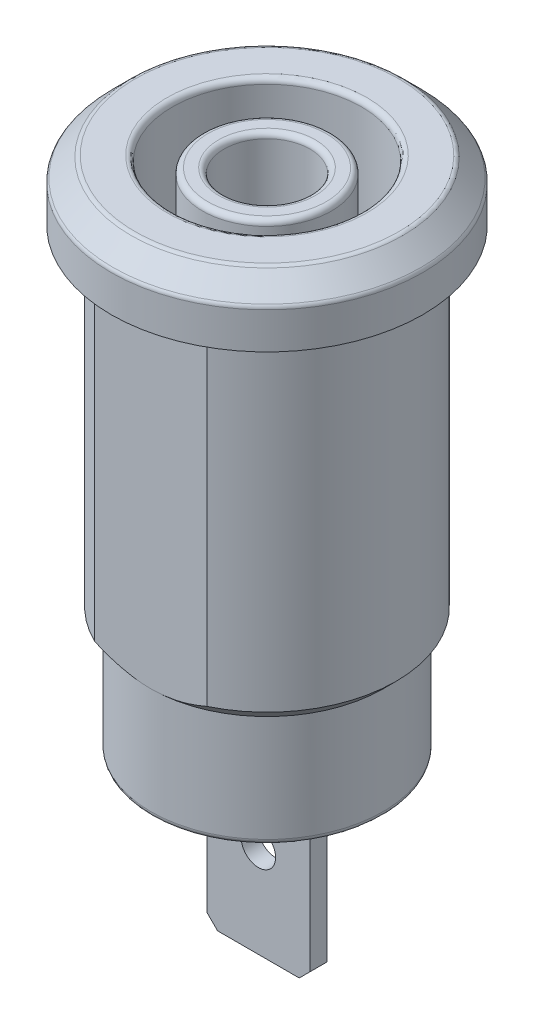
ISO-10303-21;
HEADER;
FILE_DESCRIPTION(('STEP AP214'),'2;1');
FILE_NAME('part.step','',(''),(''),'','','');
FILE_SCHEMA(('AUTOMOTIVE_DESIGN { 1 0 10303 214 1 1 1 1 }'));
ENDSEC;
DATA;
#1=APPLICATION_CONTEXT('core data for automotive mechanical design processes');
#2=APPLICATION_PROTOCOL_DEFINITION('international standard','automotive_design',2000,#1);
#3=PRODUCT_CONTEXT('',#1,'mechanical');
#4=PRODUCT('Part','Part','',(#3));
#5=PRODUCT_RELATED_PRODUCT_CATEGORY('part','',(#4));
#6=PRODUCT_DEFINITION_FORMATION('','',#4);
#7=PRODUCT_DEFINITION_CONTEXT('part definition',#1,'design');
#8=PRODUCT_DEFINITION('design','',#6,#7);
#9=PRODUCT_DEFINITION_SHAPE('','',#8);
#10=(LENGTH_UNIT() NAMED_UNIT(*) SI_UNIT(.MILLI.,.METRE.));
#11=(NAMED_UNIT(*) PLANE_ANGLE_UNIT() SI_UNIT($,.RADIAN.));
#12=(NAMED_UNIT(*) SI_UNIT($,.STERADIAN.) SOLID_ANGLE_UNIT());
#13=UNCERTAINTY_MEASURE_WITH_UNIT(LENGTH_MEASURE(1.E-05),#10,'distance_accuracy_value','');
#14=(GEOMETRIC_REPRESENTATION_CONTEXT(3) GLOBAL_UNCERTAINTY_ASSIGNED_CONTEXT((#13)) GLOBAL_UNIT_ASSIGNED_CONTEXT((#10,
#11,#12)) REPRESENTATION_CONTEXT('',''));
#15=CARTESIAN_POINT('',(0.,0.,0.));
#16=DIRECTION('',(0.,0.,1.));
#17=DIRECTION('',(1.,0.,0.));
#18=AXIS2_PLACEMENT_3D('',#15,#16,#17);
#19=CARTESIAN_POINT('',(0.,-24.,0.));
#20=DIRECTION('',(0.,-1.,0.));
#21=DIRECTION('',(0.,0.,-1.));
#22=AXIS2_PLACEMENT_3D('',#19,#20,#21);
#23=CYLINDRICAL_SURFACE('',#22,6.);
#24=DIRECTION('',(0.,-1.,0.));
#25=VECTOR('',#24,1.);
#26=CARTESIAN_POINT('',(2.6153393661244,17.911157620954,-5.4));
#27=LINE('',#26,#25);
#28=CARTESIAN_POINT('',(2.6153393661244,-2.8,-5.4));
#29=VERTEX_POINT('',#28);
#30=CARTESIAN_POINT('',(2.6153393661244,-18.2,-5.4));
#31=VERTEX_POINT('',#30);
#32=EDGE_CURVE('E153',#29,#31,#27,.T.);
#33=ORIENTED_EDGE('',*,*,#32,.F.);
#34=CARTESIAN_POINT('',(0.,-2.8,0.));
#35=DIRECTION('',(0.,-1.,0.));
#36=DIRECTION('',(0.,0.,-1.));
#37=AXIS2_PLACEMENT_3D('',#34,#35,#36);
#38=CIRCLE('',#37,6.);
#39=CARTESIAN_POINT('',(2.6153393661244,-2.8,5.4));
#40=VERTEX_POINT('',#39);
#41=EDGE_CURVE('E148',#29,#40,#38,.T.);
#42=ORIENTED_EDGE('',*,*,#41,.T.);
#43=DIRECTION('',(0.,-1.,0.));
#44=VECTOR('',#43,1.);
#45=CARTESIAN_POINT('',(2.6153393661244,17.911157620954,5.4));
#46=LINE('',#45,#44);
#47=CARTESIAN_POINT('',(2.6153393661244,-18.2,5.4));
#48=VERTEX_POINT('',#47);
#49=EDGE_CURVE('E130',#40,#48,#46,.T.);
#50=ORIENTED_EDGE('',*,*,#49,.T.);
#51=CARTESIAN_POINT('',(0.,-18.2,0.));
#52=DIRECTION('',(0.,-1.,0.));
#53=DIRECTION('',(0.,0.,-1.));
#54=AXIS2_PLACEMENT_3D('',#51,#52,#53);
#55=CIRCLE('',#54,6.);
#56=EDGE_CURVE('E159',#31,#48,#55,.T.);
#57=ORIENTED_EDGE('',*,*,#56,.F.);
#58=EDGE_LOOP('',(#33,#42,#50,#57));
#59=FACE_BOUND('',#58,.T.);
#60=ADVANCED_FACE('F46',(#59),#23,.T.);
#61=DIRECTION('',(0.,-1.,0.));
#62=VECTOR('',#61,1.);
#63=CARTESIAN_POINT('',(-2.6153393661244,17.911157620954,-5.4));
#64=LINE('',#63,#62);
#65=CARTESIAN_POINT('',(-2.6153393661244,-2.8,-5.4));
#66=VERTEX_POINT('',#65);
#67=CARTESIAN_POINT('',(-2.6153393661244,-18.2,-5.4));
#68=VERTEX_POINT('',#67);
#69=EDGE_CURVE('E681',#66,#68,#64,.T.);
#70=ORIENTED_EDGE('',*,*,#69,.T.);
#71=CARTESIAN_POINT('',(-2.6153393661244,-18.2,5.4));
#72=VERTEX_POINT('',#71);
#73=EDGE_CURVE('E290',#72,#68,#55,.T.);
#74=ORIENTED_EDGE('',*,*,#73,.F.);
#75=DIRECTION('',(0.,-1.,0.));
#76=VECTOR('',#75,1.);
#77=CARTESIAN_POINT('',(-2.6153393661244,17.911157620954,5.4));
#78=LINE('',#77,#76);
#79=CARTESIAN_POINT('',(-2.6153393661244,-2.8,5.4));
#80=VERTEX_POINT('',#79);
#81=EDGE_CURVE('E141',#80,#72,#78,.T.);
#82=ORIENTED_EDGE('',*,*,#81,.F.);
#83=EDGE_CURVE('E150',#80,#66,#38,.T.);
#84=ORIENTED_EDGE('',*,*,#83,.T.);
#85=EDGE_LOOP('',(#70,#74,#82,#84));
#86=FACE_BOUND('',#85,.T.);
#87=ADVANCED_FACE('F382',(#86),#23,.T.);
#88=CARTESIAN_POINT('',(0.,-18.2,0.));
#89=DIRECTION('',(0.,1.,0.));
#90=DIRECTION('',(0.,0.,1.));
#91=AXIS2_PLACEMENT_3D('',#88,#89,#90);
#92=CONICAL_SURFACE('',#91,6.,0.785398163397453);
#93=CARTESIAN_POINT('',(7.88051799855966,-14.6468558094404,-5.4));
#94=CARTESIAN_POINT('',(7.74017221020052,-14.7626199716313,-5.4));
#95=CARTESIAN_POINT('',(7.59934854294888,-14.8778077851178,-5.4));
#96=CARTESIAN_POINT('',(7.31659914119185,-15.1068319058643,-5.4));
#97=CARTESIAN_POINT('',(7.17467336980966,-15.2206681675757,-5.4));
#98=CARTESIAN_POINT('',(6.88940206289736,-15.446925967279,-5.4));
#99=CARTESIAN_POINT('',(6.74605495489742,-15.5593455277286,-5.4));
#100=CARTESIAN_POINT('',(6.45794610624799,-15.7823531493775,-5.4));
#101=CARTESIAN_POINT('',(6.31318435892511,-15.8929412019301,-5.4));
#102=CARTESIAN_POINT('',(5.86985497728603,-16.2265139061073,-5.4));
#103=CARTESIAN_POINT('',(5.56871545140075,-16.4461307639529,-5.4));
#104=CARTESIAN_POINT('',(5.11042409538005,-16.7659850586157,-5.4));
#105=CARTESIAN_POINT('',(4.95659525168662,-16.8709876096033,-5.4));
#106=CARTESIAN_POINT('',(4.64637357979973,-17.0771263411528,-5.4));
#107=CARTESIAN_POINT('',(4.48998089378888,-17.1782627350901,-5.4));
#108=CARTESIAN_POINT('',(4.13062218153672,-17.4031402386419,-5.4));
#109=CARTESIAN_POINT('',(3.9267261894353,-17.5254069715341,-5.4));
#110=CARTESIAN_POINT('',(3.51329540566441,-17.759947729394,-5.4));
#111=CARTESIAN_POINT('',(3.30376234083575,-17.8722247701783,-5.4));
#112=CARTESIAN_POINT('',(2.87913300479671,-18.0831702072468,-5.4));
#113=CARTESIAN_POINT('',(2.66406812203023,-18.1819011021161,-5.4));
#114=CARTESIAN_POINT('',(2.22685748405029,-18.3622499956522,-5.4));
#115=CARTESIAN_POINT('',(2.0047156813708,-18.4438773602718,-5.4));
#116=CARTESIAN_POINT('',(1.62249657198403,-18.5634776025891,-5.4));
#117=CARTESIAN_POINT('',(1.46421343755746,-18.6071667328493,-5.4));
#118=CARTESIAN_POINT('',(1.14472131497074,-18.6821833970467,-5.4));
#119=CARTESIAN_POINT('',(0.983512735568519,-18.7135126442687,-5.4));
#120=CARTESIAN_POINT('',(0.659439725938091,-18.7622348650963,-5.4));
#121=CARTESIAN_POINT('',(0.496581268896233,-18.7796670061468,-5.4));
#122=CARTESIAN_POINT('',(0.169946440350035,-18.7997849861937,-5.4));
#123=CARTESIAN_POINT('',(0.00617010289977787,-18.802471368691,-5.4));
#124=CARTESIAN_POINT('',(-0.321096828992566,-18.7929379954228,-5.4));
#125=CARTESIAN_POINT('',(-0.484587003353726,-18.7807040560021,-5.4));
#126=CARTESIAN_POINT('',(-0.809860093596026,-18.7419987942841,-5.4));
#127=CARTESIAN_POINT('',(-0.971642859631856,-18.7155262328008,-5.4));
#128=CARTESIAN_POINT('',(-1.29306988062594,-18.6495780552557,-5.4));
#129=CARTESIAN_POINT('',(-1.45270504228862,-18.6100587244377,-5.4));
#130=CARTESIAN_POINT('',(-1.76870930749127,-18.5197367339798,-5.4));
#131=CARTESIAN_POINT('',(-1.92507838643421,-18.4689339893975,-5.4));
#132=CARTESIAN_POINT('',(-2.26242054167032,-18.3476962147427,-5.4));
#133=CARTESIAN_POINT('',(-2.44270982974381,-18.2753715460032,-5.4));
#134=CARTESIAN_POINT('',(-2.79863515154502,-18.1199753063737,-5.4));
#135=CARTESIAN_POINT('',(-2.97426897972715,-18.0368987476117,-5.4));
#136=CARTESIAN_POINT('',(-3.32150616692736,-17.8620299132164,-5.4));
#137=CARTESIAN_POINT('',(-3.49310169661547,-17.7702222086563,-5.4));
#138=CARTESIAN_POINT('',(-3.83239379345227,-17.5797630721267,-5.4));
#139=CARTESIAN_POINT('',(-4.00009091979759,-17.4811126298852,-5.4));
#140=CARTESIAN_POINT('',(-4.33318972627573,-17.2776423519917,-5.4));
#141=CARTESIAN_POINT('',(-4.49856925673257,-17.1727864262386,-5.4));
#142=CARTESIAN_POINT('',(-4.82637211814564,-16.958558008334,-5.4));
#143=CARTESIAN_POINT('',(-4.9887953626857,-16.849185384458,-5.4));
#144=CARTESIAN_POINT('',(-5.3109328562108,-16.6268606702301,-5.4));
#145=CARTESIAN_POINT('',(-5.47064958346763,-16.5139121602079,-5.4));
#146=CARTESIAN_POINT('',(-5.7878903728073,-16.2849749965794,-5.4));
#147=CARTESIAN_POINT('',(-5.94541437741838,-16.168986263517,-5.4));
#148=CARTESIAN_POINT('',(-6.25403088070918,-15.9378723762329,-5.4));
#149=CARTESIAN_POINT('',(-6.40517755457747,-15.8228194223752,-5.4));
#150=CARTESIAN_POINT('',(-6.70592588927033,-15.590684955648,-5.4));
#151=CARTESIAN_POINT('',(-6.8555274022988,-15.4736032515427,-5.4));
#152=CARTESIAN_POINT('',(-7.15168747834554,-15.239054723029,-5.4));
#153=CARTESIAN_POINT('',(-7.29826132740584,-15.1216071707167,-5.4));
#154=CARTESIAN_POINT('',(-7.5902323752724,-14.8852624613367,-5.4));
#155=CARTESIAN_POINT('',(-7.73562959259385,-14.7663653271533,-5.4));
#156=CARTESIAN_POINT('',(-7.88051799855967,-14.6468558094404,-5.4));
#157=B_SPLINE_CURVE_WITH_KNOTS('',3,(#93,#94,#95,#96,#97,#98,#99,#100,#101,#102,#103,#104,#105,
#106,#107,#108,#109,#110,#111,#112,#113,#114,#115,#116,#117,#118,#119,#120,#121,#122,#123,#124,
#125,#126,#127,#128,#129,#130,#131,#132,#133,#134,#135,#136,#137,#138,#139,#140,#141,#142,#143,
#144,#145,#146,#147,#148,#149,#150,#151,#152,#153,#154,#155,#156),.UNSPECIFIED.,.F.,.F.,(4,2,2,
2,2,2,2,2,2,2,2,2,2,2,2,2,2,2,2,2,2,2,2,2,2,2,2,2,2,2,2,4),(0.,0.545788995403366,
1.0915963324797,1.63809595955851,2.18459816593152,3.30245890012273,3.8611620670288,
4.41983435413523,5.13285329767226,5.8456562502883,6.5550511737132,7.26405660886146,
7.75624619720894,8.24836753592784,8.7390969329762,9.22980824253735,9.72098639916365,
10.2122073098999,10.7050911085736,11.1979786178446,11.7802986021396,12.3628897033444,
12.9465301471928,13.5300863490771,14.1174544290453,14.704839651078,15.2916542824447,
15.8784842655065,16.4483264707753,17.0182226864039,17.5816847034062,18.145137836599),.UNSPECIFIED.);
#158=CARTESIAN_POINT('',(0.,-18.8,-5.4));
#159=VERTEX_POINT('',#158);
#160=EDGE_CURVE('E69',#31,#159,#157,.T.);
#161=ORIENTED_EDGE('',*,*,#160,.F.);
#162=ORIENTED_EDGE('',*,*,#56,.T.);
#163=CARTESIAN_POINT('',(-7.88051799855966,-14.6468558094404,5.4));
#164=CARTESIAN_POINT('',(-7.74017221020052,-14.7626199716313,5.4));
#165=CARTESIAN_POINT('',(-7.59934854294887,-14.8778077851178,5.4));
#166=CARTESIAN_POINT('',(-7.31659914119185,-15.1068319058643,5.4));
#167=CARTESIAN_POINT('',(-7.17467336980965,-15.2206681675757,5.4));
#168=CARTESIAN_POINT('',(-6.88940206289736,-15.446925967279,5.4));
#169=CARTESIAN_POINT('',(-6.74605495489742,-15.5593455277286,5.4));
#170=CARTESIAN_POINT('',(-6.45794610624799,-15.7823531493775,5.4));
#171=CARTESIAN_POINT('',(-6.31318435892511,-15.8929412019301,5.4));
#172=CARTESIAN_POINT('',(-5.86985497728603,-16.2265139061073,5.4));
#173=CARTESIAN_POINT('',(-5.56871545140075,-16.4461307639529,5.4));
#174=CARTESIAN_POINT('',(-5.11042409538005,-16.7659850586157,5.4));
#175=CARTESIAN_POINT('',(-4.95659525168662,-16.8709876096033,5.4));
#176=CARTESIAN_POINT('',(-4.64637357979973,-17.0771263411528,5.4));
#177=CARTESIAN_POINT('',(-4.48998089378888,-17.1782627350902,5.4));
#178=CARTESIAN_POINT('',(-4.13062218153671,-17.4031402386419,5.4));
#179=CARTESIAN_POINT('',(-3.9267261894353,-17.5254069715341,5.4));
#180=CARTESIAN_POINT('',(-3.51329540566441,-17.759947729394,5.4));
#181=CARTESIAN_POINT('',(-3.30376234083574,-17.8722247701783,5.4));
#182=CARTESIAN_POINT('',(-2.87913300479671,-18.0831702072468,5.4));
#183=CARTESIAN_POINT('',(-2.66406812203022,-18.1819011021161,5.4));
#184=CARTESIAN_POINT('',(-2.22685748405029,-18.3622499956522,5.4));
#185=CARTESIAN_POINT('',(-2.0047156813708,-18.4438773602718,5.4));
#186=CARTESIAN_POINT('',(-1.62249657198403,-18.5634776025891,5.4));
#187=CARTESIAN_POINT('',(-1.46421343755746,-18.6071667328493,5.4));
#188=CARTESIAN_POINT('',(-1.14472131497074,-18.6821833970467,5.4));
#189=CARTESIAN_POINT('',(-0.983512735568518,-18.7135126442687,5.4));
#190=CARTESIAN_POINT('',(-0.659439725938091,-18.7622348650963,5.4));
#191=CARTESIAN_POINT('',(-0.496581268896233,-18.7796670061468,5.4));
#192=CARTESIAN_POINT('',(-0.169946440350035,-18.7997849861937,5.4));
#193=CARTESIAN_POINT('',(-0.00617010289977773,-18.802471368691,5.4));
#194=CARTESIAN_POINT('',(0.321096828992566,-18.7929379954228,5.4));
#195=CARTESIAN_POINT('',(0.484587003353726,-18.7807040560021,5.4));
#196=CARTESIAN_POINT('',(0.809860093596027,-18.7419987942841,5.4));
#197=CARTESIAN_POINT('',(0.971642859631856,-18.7155262328008,5.4));
#198=CARTESIAN_POINT('',(1.29306988062594,-18.6495780552557,5.4));
#199=CARTESIAN_POINT('',(1.45270504228862,-18.6100587244377,5.4));
#200=CARTESIAN_POINT('',(1.76870930749127,-18.5197367339798,5.4));
#201=CARTESIAN_POINT('',(1.92507838643421,-18.4689339893975,5.4));
#202=CARTESIAN_POINT('',(2.26242054167032,-18.3476962147427,5.4));
#203=CARTESIAN_POINT('',(2.44270982974381,-18.2753715460032,5.4));
#204=CARTESIAN_POINT('',(2.79863515154502,-18.1199753063737,5.4));
#205=CARTESIAN_POINT('',(2.97426897972715,-18.0368987476117,5.4));
#206=CARTESIAN_POINT('',(3.32150616692736,-17.8620299132164,5.4));
#207=CARTESIAN_POINT('',(3.49310169661547,-17.7702222086563,5.4));
#208=CARTESIAN_POINT('',(3.83239379345227,-17.5797630721267,5.4));
#209=CARTESIAN_POINT('',(4.00009091979759,-17.4811126298852,5.4));
#210=CARTESIAN_POINT('',(4.33318972627573,-17.2776423519917,5.4));
#211=CARTESIAN_POINT('',(4.49856925673257,-17.1727864262386,5.4));
#212=CARTESIAN_POINT('',(4.82637211814564,-16.958558008334,5.4));
#213=CARTESIAN_POINT('',(4.9887953626857,-16.849185384458,5.4));
#214=CARTESIAN_POINT('',(5.3109328562108,-16.6268606702301,5.4));
#215=CARTESIAN_POINT('',(5.47064958346763,-16.5139121602079,5.4));
#216=CARTESIAN_POINT('',(5.7878903728073,-16.2849749965794,5.4));
#217=CARTESIAN_POINT('',(5.94541437741838,-16.168986263517,5.4));
#218=CARTESIAN_POINT('',(6.25403088070918,-15.9378723762329,5.4));
#219=CARTESIAN_POINT('',(6.40517755457747,-15.8228194223752,5.4));
#220=CARTESIAN_POINT('',(6.70592588927032,-15.590684955648,5.4));
#221=CARTESIAN_POINT('',(6.8555274022988,-15.4736032515427,5.4));
#222=CARTESIAN_POINT('',(7.15168747834553,-15.239054723029,5.4));
#223=CARTESIAN_POINT('',(7.29826132740583,-15.1216071707167,5.4));
#224=CARTESIAN_POINT('',(7.59023237527239,-14.8852624613367,5.4));
#225=CARTESIAN_POINT('',(7.73562959259385,-14.7663653271533,5.4));
#226=CARTESIAN_POINT('',(7.88051799855966,-14.6468558094404,5.4));
#227=B_SPLINE_CURVE_WITH_KNOTS('',3,(#163,#164,#165,#166,#167,#168,#169,#170,#171,#172,#173,
#174,#175,#176,#177,#178,#179,#180,#181,#182,#183,#184,#185,#186,#187,#188,#189,#190,#191,#192,
#193,#194,#195,#196,#197,#198,#199,#200,#201,#202,#203,#204,#205,#206,#207,#208,#209,#210,#211,
#212,#213,#214,#215,#216,#217,#218,#219,#220,#221,#222,#223,#224,#225,#226),.UNSPECIFIED.,.F.,
.F.,(4,2,2,2,2,2,2,2,2,2,2,2,2,2,2,2,2,2,2,2,2,2,2,2,2,2,2,2,2,2,2,4),(0.,0.545788995403366,
1.0915963324797,1.63809595955851,2.18459816593151,3.30245890012272,3.8611620670288,
4.41983435413523,5.13285329767226,5.8456562502883,6.5550511737132,7.26405660886146,
7.75624619720893,8.24836753592783,8.7390969329762,9.22980824253734,9.72098639916364,
10.2122073098999,10.7050911085736,11.1979786178446,11.7802986021396,12.3628897033444,
12.9465301471928,13.5300863490771,14.1174544290453,14.704839651078,15.2916542824447,
15.8784842655065,16.4483264707753,17.0182226864039,17.5816847034062,18.145137836599),.UNSPECIFIED.);
#228=CARTESIAN_POINT('',(0.,-18.8,5.4));
#229=VERTEX_POINT('',#228);
#230=EDGE_CURVE('E135',#229,#48,#227,.T.);
#231=ORIENTED_EDGE('',*,*,#230,.F.);
#232=CARTESIAN_POINT('',(0.,-18.8,0.));
#233=DIRECTION('',(0.,-1.,0.));
#234=DIRECTION('',(0.,0.,-1.));
#235=AXIS2_PLACEMENT_3D('',#232,#233,#234);
#236=CIRCLE('',#235,5.4);
#237=EDGE_CURVE('E288',#159,#229,#236,.T.);
#238=ORIENTED_EDGE('',*,*,#237,.F.);
#239=EDGE_LOOP('',(#161,#162,#231,#238));
#240=FACE_BOUND('',#239,.T.);
#241=ADVANCED_FACE('F297',(#240),#92,.T.);
#242=EDGE_CURVE('E299',#159,#68,#157,.T.);
#243=ORIENTED_EDGE('',*,*,#242,.F.);
#244=EDGE_CURVE('E237',#229,#159,#236,.T.);
#245=ORIENTED_EDGE('',*,*,#244,.F.);
#246=EDGE_CURVE('E61',#72,#229,#227,.T.);
#247=ORIENTED_EDGE('',*,*,#246,.F.);
#248=ORIENTED_EDGE('',*,*,#73,.T.);
#249=EDGE_LOOP('',(#243,#245,#247,#248));
#250=FACE_BOUND('',#249,.T.);
#251=ADVANCED_FACE('F225',(#250),#92,.T.);
#252=CARTESIAN_POINT('',(-5.4,-24.,0.));
#253=DIRECTION('',(0.,1.,0.));
#254=DIRECTION('',(0.,0.,1.));
#255=AXIS2_PLACEMENT_3D('',#252,#253,#254);
#256=PLANE('',#255);
#257=CARTESIAN_POINT('',(0.,-24.,0.));
#258=DIRECTION('',(0.,1.,0.));
#259=DIRECTION('',(0.,0.,1.));
#260=AXIS2_PLACEMENT_3D('',#257,#258,#259);
#261=CIRCLE('',#260,5.15);
#262=CARTESIAN_POINT('',(0.,-24.,5.15));
#263=VERTEX_POINT('',#262);
#264=EDGE_CURVE('E207',#263,#263,#261,.F.);
#265=ORIENTED_EDGE('',*,*,#264,.T.);
#266=EDGE_LOOP('',(#265));
#267=FACE_BOUND('',#266,.T.);
#268=DIRECTION('',(0.,0.,-1.));
#269=VECTOR('',#268,1.);
#270=CARTESIAN_POINT('',(-2.4,-24.,0.4));
#271=LINE('',#270,#269);
#272=CARTESIAN_POINT('',(-2.4,-24.,0.4));
#273=VERTEX_POINT('',#272);
#274=CARTESIAN_POINT('',(-2.4,-24.,-0.4));
#275=VERTEX_POINT('',#274);
#276=EDGE_CURVE('E228',#273,#275,#271,.T.);
#277=ORIENTED_EDGE('',*,*,#276,.F.);
#278=DIRECTION('',(-1.,0.,0.));
#279=VECTOR('',#278,1.);
#280=CARTESIAN_POINT('',(2.4,-24.,0.4));
#281=LINE('',#280,#279);
#282=CARTESIAN_POINT('',(2.4,-24.,0.4));
#283=VERTEX_POINT('',#282);
#284=EDGE_CURVE('E231',#283,#273,#281,.T.);
#285=ORIENTED_EDGE('',*,*,#284,.F.);
#286=DIRECTION('',(0.,0.,-1.));
#287=VECTOR('',#286,1.);
#288=CARTESIAN_POINT('',(2.4,-24.,0.4));
#289=LINE('',#288,#287);
#290=CARTESIAN_POINT('',(2.4,-24.,-0.4));
#291=VERTEX_POINT('',#290);
#292=EDGE_CURVE('E268',#283,#291,#289,.T.);
#293=ORIENTED_EDGE('',*,*,#292,.T.);
#294=DIRECTION('',(-1.,0.,0.));
#295=VECTOR('',#294,1.);
#296=CARTESIAN_POINT('',(2.4,-24.,-0.4));
#297=LINE('',#296,#295);
#298=EDGE_CURVE('E234',#291,#275,#297,.T.);
#299=ORIENTED_EDGE('',*,*,#298,.T.);
#300=EDGE_LOOP('',(#277,#285,#293,#299));
#301=FACE_BOUND('',#300,.T.);
#302=ADVANCED_FACE('F221',(#267,#301),#256,.F.);
#303=CARTESIAN_POINT('',(-4.4,0.,0.));
#304=DIRECTION('',(0.,-1.,0.));
#305=DIRECTION('',(0.,0.,-1.));
#306=AXIS2_PLACEMENT_3D('',#303,#304,#305);
#307=PLANE('',#306);
#308=CARTESIAN_POINT('',(0.,0.,0.));
#309=DIRECTION('',(0.,-1.,0.));
#310=DIRECTION('',(0.,0.,-1.));
#311=AXIS2_PLACEMENT_3D('',#308,#309,#310);
#312=CIRCLE('',#311,4.65);
#313=CARTESIAN_POINT('',(0.,0.,-4.65));
#314=VERTEX_POINT('',#313);
#315=EDGE_CURVE('E192',#314,#314,#312,.T.);
#316=ORIENTED_EDGE('',*,*,#315,.T.);
#317=EDGE_LOOP('',(#316));
#318=FACE_BOUND('',#317,.T.);
#319=CARTESIAN_POINT('',(0.,0.,0.));
#320=DIRECTION('',(0.,-1.,0.));
#321=DIRECTION('',(0.,0.,-1.));
#322=AXIS2_PLACEMENT_3D('',#319,#320,#321);
#323=CIRCLE('',#322,6.14644660940673);
#324=CARTESIAN_POINT('',(0.,0.,-6.14644660940673));
#325=VERTEX_POINT('',#324);
#326=EDGE_CURVE('E189',#325,#325,#323,.F.);
#327=ORIENTED_EDGE('',*,*,#326,.T.);
#328=EDGE_LOOP('',(#327));
#329=FACE_BOUND('',#328,.T.);
#330=ADVANCED_FACE('F224',(#318,#329),#307,.F.);
#331=CARTESIAN_POINT('',(0.,0.,0.));
#332=DIRECTION('',(0.,-1.,0.));
#333=DIRECTION('',(0.,0.,-1.));
#334=AXIS2_PLACEMENT_3D('',#331,#332,#333);
#335=CONICAL_SURFACE('',#334,6.25000000000001,0.785398163397445);
#336=CARTESIAN_POINT('',(0.,-0.0732233047033648,0.));
#337=DIRECTION('',(0.,1.,0.));
#338=DIRECTION('',(0.,0.,1.));
#339=AXIS2_PLACEMENT_3D('',#336,#337,#338);
#340=CIRCLE('',#339,6.32322330470337);
#341=CARTESIAN_POINT('',(0.,-0.0732233047033648,6.32322330470337));
#342=VERTEX_POINT('',#341);
#343=EDGE_CURVE('E198',#342,#342,#340,.F.);
#344=ORIENTED_EDGE('',*,*,#343,.T.);
#345=EDGE_LOOP('',(#344));
#346=FACE_BOUND('',#345,.T.);
#347=CARTESIAN_POINT('',(0.,-0.926776695296637,0.));
#348=DIRECTION('',(0.,1.,0.));
#349=DIRECTION('',(0.,0.,1.));
#350=AXIS2_PLACEMENT_3D('',#347,#348,#349);
#351=CIRCLE('',#350,7.17677669529664);
#352=CARTESIAN_POINT('',(0.,-0.926776695296637,7.17677669529664));
#353=VERTEX_POINT('',#352);
#354=EDGE_CURVE('E195',#353,#353,#351,.T.);
#355=ORIENTED_EDGE('',*,*,#354,.T.);
#356=EDGE_LOOP('',(#355));
#357=FACE_BOUND('',#356,.T.);
#358=ADVANCED_FACE('F390',(#346,#357),#335,.T.);
#359=CARTESIAN_POINT('',(0.,-24.,0.));
#360=DIRECTION('',(0.,-1.,0.));
#361=DIRECTION('',(0.,0.,-1.));
#362=AXIS2_PLACEMENT_3D('',#359,#360,#361);
#363=CYLINDRICAL_SURFACE('',#362,7.25);
#364=CARTESIAN_POINT('',(0.,-1.10355339059327,0.));
#365=DIRECTION('',(0.,1.,0.));
#366=DIRECTION('',(0.,0.,1.));
#367=AXIS2_PLACEMENT_3D('',#364,#365,#366);
#368=CIRCLE('',#367,7.25);
#369=CARTESIAN_POINT('',(0.,-1.10355339059327,7.25));
#370=VERTEX_POINT('',#369);
#371=EDGE_CURVE('E12',#370,#370,#368,.F.);
#372=ORIENTED_EDGE('',*,*,#371,.T.);
#373=EDGE_LOOP('',(#372));
#374=FACE_BOUND('',#373,.T.);
#375=CARTESIAN_POINT('',(0.,-2.8,0.));
#376=DIRECTION('',(0.,-1.,0.));
#377=DIRECTION('',(0.,0.,-1.));
#378=AXIS2_PLACEMENT_3D('',#375,#376,#377);
#379=CIRCLE('',#378,7.25);
#380=CARTESIAN_POINT('',(0.,-2.8,-7.25));
#381=VERTEX_POINT('',#380);
#382=EDGE_CURVE('E154',#381,#381,#379,.T.);
#383=ORIENTED_EDGE('',*,*,#382,.F.);
#384=EDGE_LOOP('',(#383));
#385=FACE_BOUND('',#384,.T.);
#386=ADVANCED_FACE('F379',(#374,#385),#363,.T.);
#387=CARTESIAN_POINT('',(-7.25,-2.8,0.));
#388=DIRECTION('',(0.,1.,0.));
#389=DIRECTION('',(0.,0.,1.));
#390=AXIS2_PLACEMENT_3D('',#387,#388,#389);
#391=PLANE('',#390);
#392=ORIENTED_EDGE('',*,*,#41,.F.);
#393=DIRECTION('',(1.,0.,0.));
#394=VECTOR('',#393,1.);
#395=CARTESIAN_POINT('',(-2.6153393661244,-2.8,-5.4));
#396=LINE('',#395,#394);
#397=EDGE_CURVE('E140',#66,#29,#396,.T.);
#398=ORIENTED_EDGE('',*,*,#397,.F.);
#399=ORIENTED_EDGE('',*,*,#83,.F.);
#400=DIRECTION('',(-1.,0.,0.));
#401=VECTOR('',#400,1.);
#402=CARTESIAN_POINT('',(2.6153393661244,-2.8,5.4));
#403=LINE('',#402,#401);
#404=EDGE_CURVE('E133',#40,#80,#403,.T.);
#405=ORIENTED_EDGE('',*,*,#404,.F.);
#406=EDGE_LOOP('',(#392,#398,#399,#405));
#407=FACE_BOUND('',#406,.T.);
#408=ORIENTED_EDGE('',*,*,#382,.T.);
#409=EDGE_LOOP('',(#408));
#410=FACE_BOUND('',#409,.T.);
#411=ADVANCED_FACE('F146',(#407,#410),#391,.F.);
#412=CARTESIAN_POINT('',(0.,-24.,0.));
#413=DIRECTION('',(0.,-1.,0.));
#414=DIRECTION('',(0.,0.,-1.));
#415=AXIS2_PLACEMENT_3D('',#412,#413,#414);
#416=CYLINDRICAL_SURFACE('',#415,5.4);
#417=CARTESIAN_POINT('',(0.,-23.75,0.));
#418=DIRECTION('',(0.,1.,0.));
#419=DIRECTION('',(0.,0.,1.));
#420=AXIS2_PLACEMENT_3D('',#417,#418,#419);
#421=CIRCLE('',#420,5.4);
#422=CARTESIAN_POINT('',(0.,-23.75,5.4));
#423=VERTEX_POINT('',#422);
#424=EDGE_CURVE('E54',#423,#423,#421,.T.);
#425=ORIENTED_EDGE('',*,*,#424,.T.);
#426=EDGE_LOOP('',(#425));
#427=FACE_BOUND('',#426,.T.);
#428=ORIENTED_EDGE('',*,*,#244,.T.);
#429=ORIENTED_EDGE('',*,*,#237,.T.);
#430=EDGE_LOOP('',(#428,#429));
#431=FACE_BOUND('',#430,.T.);
#432=ADVANCED_FACE('F212',(#427,#431),#416,.T.);
#433=CARTESIAN_POINT('',(0.,-21.1547005383792,0.));
#434=DIRECTION('',(0.,1.,0.));
#435=DIRECTION('',(0.,0.,1.));
#436=AXIS2_PLACEMENT_3D('',#433,#434,#435);
#437=CONICAL_SURFACE('',#436,0.,1.0471975511966);
#438=CARTESIAN_POINT('',(0.,-20.0721687836487,0.));
#439=DIRECTION('',(0.,1.,0.));
#440=DIRECTION('',(0.,0.,1.));
#441=AXIS2_PLACEMENT_3D('',#438,#439,#440);
#442=CIRCLE('',#441,1.875);
#443=CARTESIAN_POINT('',(0.,-20.0721687836487,1.875));
#444=VERTEX_POINT('',#443);
#445=EDGE_CURVE('E168',#444,#444,#442,.T.);
#446=ORIENTED_EDGE('',*,*,#445,.T.);
#447=EDGE_LOOP('',(#446));
#448=FACE_BOUND('',#447,.T.);
#449=CARTESIAN_POINT('',(0.,-21.1547005383792,0.));
#450=VERTEX_POINT('',#449);
#451=VERTEX_LOOP('',#450);
#452=FACE_BOUND('',#451,.T.);
#453=ADVANCED_FACE('F370',(#448,#452),#437,.F.);
#454=CARTESIAN_POINT('',(0.,-24.,0.));
#455=DIRECTION('',(0.,-1.,0.));
#456=DIRECTION('',(0.,0.,-1.));
#457=AXIS2_PLACEMENT_3D('',#454,#455,#456);
#458=CYLINDRICAL_SURFACE('',#457,2.);
#459=CARTESIAN_POINT('',(0.,-19.8556624327026,0.));
#460=DIRECTION('',(0.,-1.,0.));
#461=DIRECTION('',(0.,0.,-1.));
#462=AXIS2_PLACEMENT_3D('',#459,#460,#461);
#463=CIRCLE('',#462,2.);
#464=CARTESIAN_POINT('',(0.,-19.8556624327026,-2.));
#465=VERTEX_POINT('',#464);
#466=EDGE_CURVE('E165',#465,#465,#463,.T.);
#467=ORIENTED_EDGE('',*,*,#466,.T.);
#468=EDGE_LOOP('',(#467));
#469=FACE_BOUND('',#468,.T.);
#470=CARTESIAN_POINT('',(0.,-0.750000000000001,0.));
#471=DIRECTION('',(0.,-1.,0.));
#472=DIRECTION('',(0.,0.,-1.));
#473=AXIS2_PLACEMENT_3D('',#470,#471,#472);
#474=CIRCLE('',#473,2.);
#475=CARTESIAN_POINT('',(0.,-0.750000000000001,-2.));
#476=VERTEX_POINT('',#475);
#477=EDGE_CURVE('E157',#476,#476,#474,.F.);
#478=ORIENTED_EDGE('',*,*,#477,.T.);
#479=EDGE_LOOP('',(#478));
#480=FACE_BOUND('',#479,.T.);
#481=ADVANCED_FACE('F366',(#469,#480),#458,.F.);
#482=CARTESIAN_POINT('',(-3.,-0.5,0.));
#483=DIRECTION('',(0.,-1.,0.));
#484=DIRECTION('',(0.,0.,-1.));
#485=AXIS2_PLACEMENT_3D('',#482,#483,#484);
#486=PLANE('',#485);
#487=CARTESIAN_POINT('',(0.,-0.5,0.));
#488=DIRECTION('',(0.,-1.,0.));
#489=DIRECTION('',(0.,0.,-1.));
#490=AXIS2_PLACEMENT_3D('',#487,#488,#489);
#491=CIRCLE('',#490,2.25);
#492=CARTESIAN_POINT('',(0.,-0.5,-2.25));
#493=VERTEX_POINT('',#492);
#494=EDGE_CURVE('E204',#493,#493,#491,.T.);
#495=ORIENTED_EDGE('',*,*,#494,.T.);
#496=EDGE_LOOP('',(#495));
#497=FACE_BOUND('',#496,.T.);
#498=CARTESIAN_POINT('',(0.,-0.5,0.));
#499=DIRECTION('',(0.,-1.,0.));
#500=DIRECTION('',(0.,0.,-1.));
#501=AXIS2_PLACEMENT_3D('',#498,#499,#500);
#502=CIRCLE('',#501,2.75);
#503=CARTESIAN_POINT('',(0.,-0.5,-2.75));
#504=VERTEX_POINT('',#503);
#505=EDGE_CURVE('E201',#504,#504,#502,.F.);
#506=ORIENTED_EDGE('',*,*,#505,.T.);
#507=EDGE_LOOP('',(#506));
#508=FACE_BOUND('',#507,.T.);
#509=ADVANCED_FACE('F362',(#497,#508),#486,.F.);
#510=CARTESIAN_POINT('',(0.,-24.,0.));
#511=DIRECTION('',(0.,-1.,0.));
#512=DIRECTION('',(0.,0.,-1.));
#513=AXIS2_PLACEMENT_3D('',#510,#511,#512);
#514=CYLINDRICAL_SURFACE('',#513,3.);
#515=CARTESIAN_POINT('',(0.,-21.25,0.));
#516=DIRECTION('',(0.,-1.,0.));
#517=DIRECTION('',(0.,0.,-1.));
#518=AXIS2_PLACEMENT_3D('',#515,#516,#517);
#519=CIRCLE('',#518,3.);
#520=CARTESIAN_POINT('',(0.,-21.25,-3.));
#521=VERTEX_POINT('',#520);
#522=EDGE_CURVE('E180',#521,#521,#519,.F.);
#523=ORIENTED_EDGE('',*,*,#522,.T.);
#524=EDGE_LOOP('',(#523));
#525=FACE_BOUND('',#524,.T.);
#526=CARTESIAN_POINT('',(0.,-0.750000000000001,0.));
#527=DIRECTION('',(0.,-1.,0.));
#528=DIRECTION('',(0.,0.,-1.));
#529=AXIS2_PLACEMENT_3D('',#526,#527,#528);
#530=CIRCLE('',#529,3.);
#531=CARTESIAN_POINT('',(0.,-0.750000000000001,-3.));
#532=VERTEX_POINT('',#531);
#533=EDGE_CURVE('E177',#532,#532,#530,.T.);
#534=ORIENTED_EDGE('',*,*,#533,.T.);
#535=EDGE_LOOP('',(#534));
#536=FACE_BOUND('',#535,.T.);
#537=ADVANCED_FACE('F358',(#525,#536),#514,.T.);
#538=CARTESIAN_POINT('',(-4.4,-21.5,0.));
#539=DIRECTION('',(0.,-1.,0.));
#540=DIRECTION('',(0.,0.,-1.));
#541=AXIS2_PLACEMENT_3D('',#538,#539,#540);
#542=PLANE('',#541);
#543=CARTESIAN_POINT('',(0.,-21.5,0.));
#544=DIRECTION('',(0.,-1.,0.));
#545=DIRECTION('',(0.,0.,-1.));
#546=AXIS2_PLACEMENT_3D('',#543,#544,#545);
#547=CIRCLE('',#546,3.25);
#548=CARTESIAN_POINT('',(0.,-21.5,-3.25));
#549=VERTEX_POINT('',#548);
#550=EDGE_CURVE('E174',#549,#549,#547,.T.);
#551=ORIENTED_EDGE('',*,*,#550,.T.);
#552=EDGE_LOOP('',(#551));
#553=FACE_BOUND('',#552,.T.);
#554=CARTESIAN_POINT('',(0.,-21.5,0.));
#555=DIRECTION('',(0.,-1.,0.));
#556=DIRECTION('',(0.,0.,-1.));
#557=AXIS2_PLACEMENT_3D('',#554,#555,#556);
#558=CIRCLE('',#557,4.15);
#559=CARTESIAN_POINT('',(0.,-21.5,-4.15));
#560=VERTEX_POINT('',#559);
#561=EDGE_CURVE('E171',#560,#560,#558,.F.);
#562=ORIENTED_EDGE('',*,*,#561,.T.);
#563=EDGE_LOOP('',(#562));
#564=FACE_BOUND('',#563,.T.);
#565=ADVANCED_FACE('F354',(#553,#564),#542,.F.);
#566=CARTESIAN_POINT('',(0.,-24.,0.));
#567=DIRECTION('',(0.,-1.,0.));
#568=DIRECTION('',(0.,0.,-1.));
#569=AXIS2_PLACEMENT_3D('',#566,#567,#568);
#570=CYLINDRICAL_SURFACE('',#569,4.4);
#571=CARTESIAN_POINT('',(0.,-21.25,0.));
#572=DIRECTION('',(0.,-1.,0.));
#573=DIRECTION('',(0.,0.,-1.));
#574=AXIS2_PLACEMENT_3D('',#571,#572,#573);
#575=CIRCLE('',#574,4.4);
#576=CARTESIAN_POINT('',(0.,-21.25,-4.4));
#577=VERTEX_POINT('',#576);
#578=EDGE_CURVE('E186',#577,#577,#575,.T.);
#579=ORIENTED_EDGE('',*,*,#578,.T.);
#580=EDGE_LOOP('',(#579));
#581=FACE_BOUND('',#580,.T.);
#582=CARTESIAN_POINT('',(0.,-0.25,0.));
#583=DIRECTION('',(0.,-1.,0.));
#584=DIRECTION('',(0.,0.,-1.));
#585=AXIS2_PLACEMENT_3D('',#582,#583,#584);
#586=CIRCLE('',#585,4.4);
#587=CARTESIAN_POINT('',(0.,-0.25,-4.4));
#588=VERTEX_POINT('',#587);
#589=EDGE_CURVE('E183',#588,#588,#586,.F.);
#590=ORIENTED_EDGE('',*,*,#589,.T.);
#591=EDGE_LOOP('',(#590));
#592=FACE_BOUND('',#591,.T.);
#593=ADVANCED_FACE('F331',(#581,#592),#570,.F.);
#594=CARTESIAN_POINT('',(0.,0.,0.4));
#595=DIRECTION('',(0.,0.,1.));
#596=DIRECTION('',(1.,0.,0.));
#597=AXIS2_PLACEMENT_3D('',#594,#595,#596);
#598=PLANE('',#597);
#599=ORIENTED_EDGE('',*,*,#284,.T.);
#600=DIRECTION('',(0.,-1.,0.));
#601=VECTOR('',#600,1.);
#602=CARTESIAN_POINT('',(-2.4,-24.,0.4));
#603=LINE('',#602,#601);
#604=CARTESIAN_POINT('',(-2.4,-31.5,0.4));
#605=VERTEX_POINT('',#604);
#606=EDGE_CURVE('E241',#273,#605,#603,.T.);
#607=ORIENTED_EDGE('',*,*,#606,.T.);
#608=DIRECTION('',(0.707106781186547,-0.707106781186547,0.));
#609=VECTOR('',#608,1.);
#610=CARTESIAN_POINT('',(-2.4,-31.5,0.4));
#611=LINE('',#610,#609);
#612=CARTESIAN_POINT('',(-1.9,-32.,0.4));
#613=VERTEX_POINT('',#612);
#614=EDGE_CURVE('E246',#605,#613,#611,.T.);
#615=ORIENTED_EDGE('',*,*,#614,.T.);
#616=DIRECTION('',(1.,0.,0.));
#617=VECTOR('',#616,1.);
#618=CARTESIAN_POINT('',(-1.9,-32.,0.4));
#619=LINE('',#618,#617);
#620=CARTESIAN_POINT('',(1.89999999999999,-32.,0.4));
#621=VERTEX_POINT('',#620);
#622=EDGE_CURVE('E263',#613,#621,#619,.T.);
#623=ORIENTED_EDGE('',*,*,#622,.T.);
#624=DIRECTION('',(0.707106781186551,0.707106781186544,0.));
#625=VECTOR('',#624,1.);
#626=CARTESIAN_POINT('',(1.89999999999999,-32.,0.4));
#627=LINE('',#626,#625);
#628=CARTESIAN_POINT('',(2.4,-31.5,0.4));
#629=VERTEX_POINT('',#628);
#630=EDGE_CURVE('E265',#621,#629,#627,.T.);
#631=ORIENTED_EDGE('',*,*,#630,.T.);
#632=DIRECTION('',(0.,1.,0.));
#633=VECTOR('',#632,1.);
#634=CARTESIAN_POINT('',(2.4,-31.5,0.4));
#635=LINE('',#634,#633);
#636=EDGE_CURVE('E251',#629,#283,#635,.T.);
#637=ORIENTED_EDGE('',*,*,#636,.T.);
#638=EDGE_LOOP('',(#599,#607,#615,#623,#631,#637));
#639=FACE_BOUND('',#638,.T.);
#640=CARTESIAN_POINT('',(0.,-27.7,0.4));
#641=DIRECTION('',(0.,0.,1.));
#642=DIRECTION('',(1.,0.,0.));
#643=AXIS2_PLACEMENT_3D('',#640,#641,#642);
#644=CIRCLE('',#643,0.8);
#645=CARTESIAN_POINT('',(0.8,-27.7,0.4));
#646=VERTEX_POINT('',#645);
#647=EDGE_CURVE('E271',#646,#646,#644,.T.);
#648=ORIENTED_EDGE('',*,*,#647,.F.);
#649=EDGE_LOOP('',(#648));
#650=FACE_BOUND('',#649,.T.);
#651=ADVANCED_FACE('F248',(#639,#650),#598,.T.);
#652=CARTESIAN_POINT('',(0.,0.,-0.4));
#653=DIRECTION('',(0.,0.,1.));
#654=DIRECTION('',(1.,0.,0.));
#655=AXIS2_PLACEMENT_3D('',#652,#653,#654);
#656=PLANE('',#655);
#657=ORIENTED_EDGE('',*,*,#298,.F.);
#658=DIRECTION('',(0.,1.,0.));
#659=VECTOR('',#658,1.);
#660=CARTESIAN_POINT('',(2.4,-31.5,-0.4));
#661=LINE('',#660,#659);
#662=CARTESIAN_POINT('',(2.4,-31.5,-0.4));
#663=VERTEX_POINT('',#662);
#664=EDGE_CURVE('E253',#663,#291,#661,.T.);
#665=ORIENTED_EDGE('',*,*,#664,.F.);
#666=DIRECTION('',(0.707106781186551,0.707106781186544,0.));
#667=VECTOR('',#666,1.);
#668=CARTESIAN_POINT('',(1.89999999999999,-32.,-0.4));
#669=LINE('',#668,#667);
#670=CARTESIAN_POINT('',(1.89999999999999,-32.,-0.4));
#671=VERTEX_POINT('',#670);
#672=EDGE_CURVE('E256',#671,#663,#669,.T.);
#673=ORIENTED_EDGE('',*,*,#672,.F.);
#674=DIRECTION('',(1.,0.,0.));
#675=VECTOR('',#674,1.);
#676=CARTESIAN_POINT('',(-1.9,-32.,-0.4));
#677=LINE('',#676,#675);
#678=CARTESIAN_POINT('',(-1.9,-32.,-0.4));
#679=VERTEX_POINT('',#678);
#680=EDGE_CURVE('E275',#679,#671,#677,.T.);
#681=ORIENTED_EDGE('',*,*,#680,.F.);
#682=DIRECTION('',(0.707106781186547,-0.707106781186547,0.));
#683=VECTOR('',#682,1.);
#684=CARTESIAN_POINT('',(-2.4,-31.5,-0.4));
#685=LINE('',#684,#683);
#686=CARTESIAN_POINT('',(-2.4,-31.5,-0.4));
#687=VERTEX_POINT('',#686);
#688=EDGE_CURVE('E273',#687,#679,#685,.T.);
#689=ORIENTED_EDGE('',*,*,#688,.F.);
#690=DIRECTION('',(0.,-1.,0.));
#691=VECTOR('',#690,1.);
#692=CARTESIAN_POINT('',(-2.4,-24.,-0.4));
#693=LINE('',#692,#691);
#694=EDGE_CURVE('E270',#275,#687,#693,.T.);
#695=ORIENTED_EDGE('',*,*,#694,.F.);
#696=EDGE_LOOP('',(#657,#665,#673,#681,#689,#695));
#697=FACE_BOUND('',#696,.T.);
#698=CARTESIAN_POINT('',(0.,-27.7,-0.4));
#699=DIRECTION('',(0.,0.,1.));
#700=DIRECTION('',(1.,0.,0.));
#701=AXIS2_PLACEMENT_3D('',#698,#699,#700);
#702=CIRCLE('',#701,0.8);
#703=CARTESIAN_POINT('',(0.8,-27.7,-0.4));
#704=VERTEX_POINT('',#703);
#705=EDGE_CURVE('E259',#704,#704,#702,.T.);
#706=ORIENTED_EDGE('',*,*,#705,.T.);
#707=EDGE_LOOP('',(#706));
#708=FACE_BOUND('',#707,.T.);
#709=ADVANCED_FACE('F330',(#697,#708),#656,.F.);
#710=CARTESIAN_POINT('',(-2.4,-24.,0.4));
#711=DIRECTION('',(1.,0.,0.));
#712=DIRECTION('',(0.,1.,0.));
#713=AXIS2_PLACEMENT_3D('',#710,#711,#712);
#714=PLANE('',#713);
#715=ORIENTED_EDGE('',*,*,#694,.T.);
#716=DIRECTION('',(0.,0.,-1.));
#717=VECTOR('',#716,1.);
#718=CARTESIAN_POINT('',(-2.4,-31.5,0.4));
#719=LINE('',#718,#717);
#720=EDGE_CURVE('E238',#605,#687,#719,.T.);
#721=ORIENTED_EDGE('',*,*,#720,.F.);
#722=ORIENTED_EDGE('',*,*,#606,.F.);
#723=ORIENTED_EDGE('',*,*,#276,.T.);
#724=EDGE_LOOP('',(#715,#721,#722,#723));
#725=FACE_BOUND('',#724,.T.);
#726=ADVANCED_FACE('F242',(#725),#714,.F.);
#727=CARTESIAN_POINT('',(-2.4,-31.5,0.4));
#728=DIRECTION('',(0.707106781186548,0.707106781186548,0.));
#729=DIRECTION('',(-0.707106781186548,0.707106781186548,0.));
#730=AXIS2_PLACEMENT_3D('',#727,#728,#729);
#731=PLANE('',#730);
#732=ORIENTED_EDGE('',*,*,#688,.T.);
#733=DIRECTION('',(0.,0.,-1.));
#734=VECTOR('',#733,1.);
#735=CARTESIAN_POINT('',(-1.9,-32.,0.4));
#736=LINE('',#735,#734);
#737=EDGE_CURVE('E285',#613,#679,#736,.T.);
#738=ORIENTED_EDGE('',*,*,#737,.F.);
#739=ORIENTED_EDGE('',*,*,#614,.F.);
#740=ORIENTED_EDGE('',*,*,#720,.T.);
#741=EDGE_LOOP('',(#732,#738,#739,#740));
#742=FACE_BOUND('',#741,.T.);
#743=ADVANCED_FACE('F345',(#742),#731,.F.);
#744=CARTESIAN_POINT('',(-1.9,-32.,0.4));
#745=DIRECTION('',(0.,1.,0.));
#746=DIRECTION('',(-1.,0.,0.));
#747=AXIS2_PLACEMENT_3D('',#744,#745,#746);
#748=PLANE('',#747);
#749=ORIENTED_EDGE('',*,*,#680,.T.);
#750=DIRECTION('',(0.,0.,-1.));
#751=VECTOR('',#750,1.);
#752=CARTESIAN_POINT('',(1.89999999999999,-32.,0.4));
#753=LINE('',#752,#751);
#754=EDGE_CURVE('E282',#621,#671,#753,.T.);
#755=ORIENTED_EDGE('',*,*,#754,.F.);
#756=ORIENTED_EDGE('',*,*,#622,.F.);
#757=ORIENTED_EDGE('',*,*,#737,.T.);
#758=EDGE_LOOP('',(#749,#755,#756,#757));
#759=FACE_BOUND('',#758,.T.);
#760=ADVANCED_FACE('F341',(#759),#748,.F.);
#761=CARTESIAN_POINT('',(1.89999999999999,-32.,0.4));
#762=DIRECTION('',(-0.707106781186544,0.707106781186551,0.));
#763=DIRECTION('',(-0.707106781186551,-0.707106781186544,0.));
#764=AXIS2_PLACEMENT_3D('',#761,#762,#763);
#765=PLANE('',#764);
#766=ORIENTED_EDGE('',*,*,#672,.T.);
#767=DIRECTION('',(0.,0.,-1.));
#768=VECTOR('',#767,1.);
#769=CARTESIAN_POINT('',(2.4,-31.5,0.4));
#770=LINE('',#769,#768);
#771=EDGE_CURVE('E279',#629,#663,#770,.T.);
#772=ORIENTED_EDGE('',*,*,#771,.F.);
#773=ORIENTED_EDGE('',*,*,#630,.F.);
#774=ORIENTED_EDGE('',*,*,#754,.T.);
#775=EDGE_LOOP('',(#766,#772,#773,#774));
#776=FACE_BOUND('',#775,.T.);
#777=ADVANCED_FACE('F337',(#776),#765,.F.);
#778=CARTESIAN_POINT('',(2.4,-31.5,0.4));
#779=DIRECTION('',(-1.,0.,0.));
#780=DIRECTION('',(0.,-1.,0.));
#781=AXIS2_PLACEMENT_3D('',#778,#779,#780);
#782=PLANE('',#781);
#783=ORIENTED_EDGE('',*,*,#664,.T.);
#784=ORIENTED_EDGE('',*,*,#292,.F.);
#785=ORIENTED_EDGE('',*,*,#636,.F.);
#786=ORIENTED_EDGE('',*,*,#771,.T.);
#787=EDGE_LOOP('',(#783,#784,#785,#786));
#788=FACE_BOUND('',#787,.T.);
#789=ADVANCED_FACE('F326',(#788),#782,.F.);
#790=CARTESIAN_POINT('',(0.,-27.7,0.4));
#791=DIRECTION('',(0.,0.,-1.));
#792=DIRECTION('',(-1.,0.,0.));
#793=AXIS2_PLACEMENT_3D('',#790,#791,#792);
#794=CYLINDRICAL_SURFACE('',#793,0.8);
#795=ORIENTED_EDGE('',*,*,#647,.T.);
#796=EDGE_LOOP('',(#795));
#797=FACE_BOUND('',#796,.T.);
#798=ORIENTED_EDGE('',*,*,#705,.F.);
#799=EDGE_LOOP('',(#798));
#800=FACE_BOUND('',#799,.T.);
#801=ADVANCED_FACE('F319',(#797,#800),#794,.F.);
#802=CARTESIAN_POINT('',(2.6153393661244,17.911157620954,5.4));
#803=DIRECTION('',(0.,0.,1.));
#804=DIRECTION('',(1.,0.,0.));
#805=AXIS2_PLACEMENT_3D('',#802,#803,#804);
#806=PLANE('',#805);
#807=ORIENTED_EDGE('',*,*,#246,.T.);
#808=ORIENTED_EDGE('',*,*,#230,.T.);
#809=ORIENTED_EDGE('',*,*,#49,.F.);
#810=ORIENTED_EDGE('',*,*,#404,.T.);
#811=ORIENTED_EDGE('',*,*,#81,.T.);
#812=EDGE_LOOP('',(#807,#808,#809,#810,#811));
#813=FACE_BOUND('',#812,.T.);
#814=ADVANCED_FACE('F132',(#813),#806,.T.);
#815=CARTESIAN_POINT('',(-2.6153393661244,17.911157620954,-5.4));
#816=DIRECTION('',(0.,0.,-1.));
#817=DIRECTION('',(-1.,0.,0.));
#818=AXIS2_PLACEMENT_3D('',#815,#816,#817);
#819=PLANE('',#818);
#820=ORIENTED_EDGE('',*,*,#160,.T.);
#821=ORIENTED_EDGE('',*,*,#242,.T.);
#822=ORIENTED_EDGE('',*,*,#69,.F.);
#823=ORIENTED_EDGE('',*,*,#397,.T.);
#824=ORIENTED_EDGE('',*,*,#32,.T.);
#825=EDGE_LOOP('',(#820,#821,#822,#823,#824));
#826=FACE_BOUND('',#825,.T.);
#827=ADVANCED_FACE('F318',(#826),#819,.T.);
#828=CARTESIAN_POINT('',(0.,-19.8556624327026,0.));
#829=DIRECTION('',(0.,-1.,0.));
#830=DIRECTION('',(0.,0.,-1.));
#831=AXIS2_PLACEMENT_3D('',#828,#829,#830);
#832=TOROIDAL_SURFACE('',#831,1.75,0.25);
#833=ORIENTED_EDGE('',*,*,#445,.F.);
#834=EDGE_LOOP('',(#833));
#835=FACE_BOUND('',#834,.T.);
#836=ORIENTED_EDGE('',*,*,#466,.F.);
#837=EDGE_LOOP('',(#836));
#838=FACE_BOUND('',#837,.T.);
#839=ADVANCED_FACE('F323',(#835,#838),#832,.F.);
#840=CARTESIAN_POINT('',(0.,-21.25,0.));
#841=DIRECTION('',(0.,-1.,0.));
#842=DIRECTION('',(0.,0.,-1.));
#843=AXIS2_PLACEMENT_3D('',#840,#841,#842);
#844=TOROIDAL_SURFACE('',#843,3.25,0.25);
#845=ORIENTED_EDGE('',*,*,#522,.F.);
#846=EDGE_LOOP('',(#845));
#847=FACE_BOUND('',#846,.T.);
#848=ORIENTED_EDGE('',*,*,#550,.F.);
#849=EDGE_LOOP('',(#848));
#850=FACE_BOUND('',#849,.T.);
#851=ADVANCED_FACE('F400',(#847,#850),#844,.F.);
#852=CARTESIAN_POINT('',(0.,-21.25,0.));
#853=DIRECTION('',(0.,-1.,0.));
#854=DIRECTION('',(0.,0.,-1.));
#855=AXIS2_PLACEMENT_3D('',#852,#853,#854);
#856=TOROIDAL_SURFACE('',#855,4.15,0.25);
#857=ORIENTED_EDGE('',*,*,#561,.F.);
#858=EDGE_LOOP('',(#857));
#859=FACE_BOUND('',#858,.T.);
#860=ORIENTED_EDGE('',*,*,#578,.F.);
#861=EDGE_LOOP('',(#860));
#862=FACE_BOUND('',#861,.T.);
#863=ADVANCED_FACE('F404',(#859,#862),#856,.F.);
#864=CARTESIAN_POINT('',(0.,-0.25,0.));
#865=DIRECTION('',(0.,-1.,0.));
#866=DIRECTION('',(0.,0.,-1.));
#867=AXIS2_PLACEMENT_3D('',#864,#865,#866);
#868=TOROIDAL_SURFACE('',#867,4.65,0.25);
#869=ORIENTED_EDGE('',*,*,#589,.F.);
#870=EDGE_LOOP('',(#869));
#871=FACE_BOUND('',#870,.T.);
#872=ORIENTED_EDGE('',*,*,#315,.F.);
#873=EDGE_LOOP('',(#872));
#874=FACE_BOUND('',#873,.T.);
#875=ADVANCED_FACE('F408',(#871,#874),#868,.T.);
#876=CARTESIAN_POINT('',(0.,-0.25,0.));
#877=DIRECTION('',(0.,-1.,0.));
#878=DIRECTION('',(0.,0.,-1.));
#879=AXIS2_PLACEMENT_3D('',#876,#877,#878);
#880=TOROIDAL_SURFACE('',#879,6.14644660940673,0.25);
#881=ORIENTED_EDGE('',*,*,#326,.F.);
#882=EDGE_LOOP('',(#881));
#883=FACE_BOUND('',#882,.T.);
#884=ORIENTED_EDGE('',*,*,#343,.F.);
#885=EDGE_LOOP('',(#884));
#886=FACE_BOUND('',#885,.T.);
#887=ADVANCED_FACE('F412',(#883,#886),#880,.T.);
#888=CARTESIAN_POINT('',(0.,-0.750000000000001,0.));
#889=DIRECTION('',(0.,-1.,0.));
#890=DIRECTION('',(0.,0.,-1.));
#891=AXIS2_PLACEMENT_3D('',#888,#889,#890);
#892=TOROIDAL_SURFACE('',#891,2.25,0.25);
#893=ORIENTED_EDGE('',*,*,#477,.F.);
#894=EDGE_LOOP('',(#893));
#895=FACE_BOUND('',#894,.T.);
#896=ORIENTED_EDGE('',*,*,#494,.F.);
#897=EDGE_LOOP('',(#896));
#898=FACE_BOUND('',#897,.T.);
#899=ADVANCED_FACE('F416',(#895,#898),#892,.T.);
#900=CARTESIAN_POINT('',(0.,-0.750000000000001,0.));
#901=DIRECTION('',(0.,-1.,0.));
#902=DIRECTION('',(0.,0.,-1.));
#903=AXIS2_PLACEMENT_3D('',#900,#901,#902);
#904=TOROIDAL_SURFACE('',#903,2.75,0.25);
#905=ORIENTED_EDGE('',*,*,#505,.F.);
#906=EDGE_LOOP('',(#905));
#907=FACE_BOUND('',#906,.T.);
#908=ORIENTED_EDGE('',*,*,#533,.F.);
#909=EDGE_LOOP('',(#908));
#910=FACE_BOUND('',#909,.T.);
#911=ADVANCED_FACE('F218',(#907,#910),#904,.T.);
#912=CARTESIAN_POINT('',(0.,-23.75,0.));
#913=DIRECTION('',(0.,1.,0.));
#914=DIRECTION('',(0.,0.,1.));
#915=AXIS2_PLACEMENT_3D('',#912,#913,#914);
#916=TOROIDAL_SURFACE('',#915,5.15,0.25);
#917=ORIENTED_EDGE('',*,*,#424,.F.);
#918=EDGE_LOOP('',(#917));
#919=FACE_BOUND('',#918,.T.);
#920=ORIENTED_EDGE('',*,*,#264,.F.);
#921=EDGE_LOOP('',(#920));
#922=FACE_BOUND('',#921,.T.);
#923=ADVANCED_FACE('F215',(#919,#922),#916,.T.);
#924=CARTESIAN_POINT('',(0.,-1.10355339059327,0.));
#925=DIRECTION('',(0.,1.,0.));
#926=DIRECTION('',(0.,0.,1.));
#927=AXIS2_PLACEMENT_3D('',#924,#925,#926);
#928=TOROIDAL_SURFACE('',#927,7.,0.25);
#929=ORIENTED_EDGE('',*,*,#354,.F.);
#930=EDGE_LOOP('',(#929));
#931=FACE_BOUND('',#930,.T.);
#932=ORIENTED_EDGE('',*,*,#371,.F.);
#933=EDGE_LOOP('',(#932));
#934=FACE_BOUND('',#933,.T.);
#935=ADVANCED_FACE('F48',(#931,#934),#928,.T.);
#936=CLOSED_SHELL('',(#60,#87,#241,#251,#302,#330,#358,#386,#411,#432,#453,#481,#509,#537,#565,
#593,#651,#709,#726,#743,#760,#777,#789,#801,#814,#827,#839,#851,#863,#875,#887,#899,#911,#923,#935));
#937=MANIFOLD_SOLID_BREP('B2',#936);
#938=ADVANCED_BREP_SHAPE_REPRESENTATION('',(#18,#937),#14);
#939=SHAPE_DEFINITION_REPRESENTATION(#9,#938);
ENDSEC;
END-ISO-10303-21;
